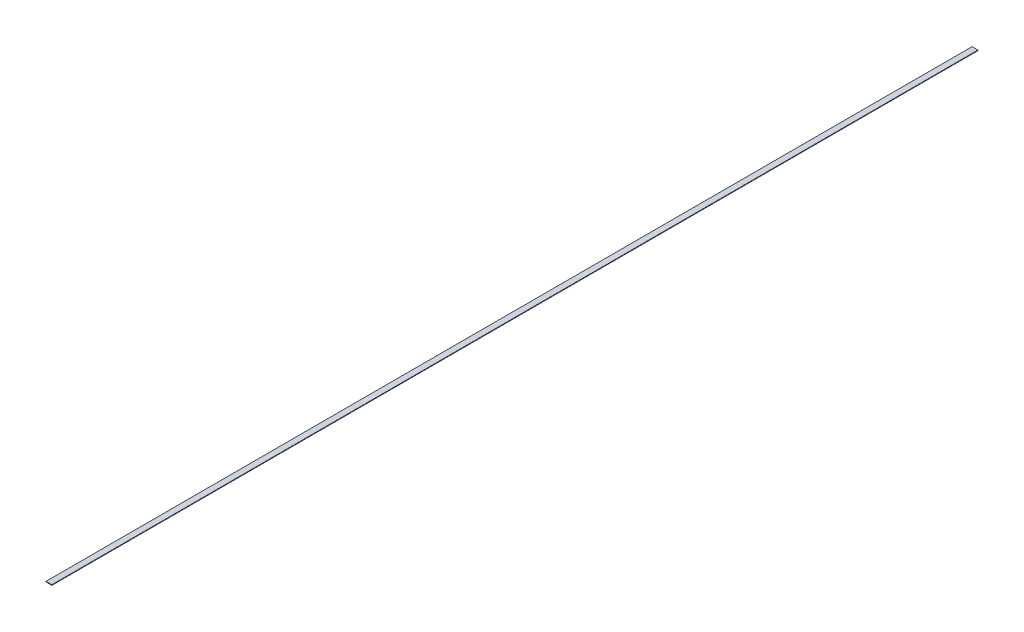
ISO-10303-21;
HEADER;
FILE_DESCRIPTION(('STEP AP214'),'2;1');
FILE_NAME('part.step','',(''),(''),'','','');
FILE_SCHEMA(('AUTOMOTIVE_DESIGN { 1 0 10303 214 1 1 1 1 }'));
ENDSEC;
DATA;
#1=APPLICATION_CONTEXT('core data for automotive mechanical design processes');
#2=APPLICATION_PROTOCOL_DEFINITION('international standard','automotive_design',2000,#1);
#3=PRODUCT_CONTEXT('',#1,'mechanical');
#4=PRODUCT('Part','Part','',(#3));
#5=PRODUCT_RELATED_PRODUCT_CATEGORY('part','',(#4));
#6=PRODUCT_DEFINITION_FORMATION('','',#4);
#7=PRODUCT_DEFINITION_CONTEXT('part definition',#1,'design');
#8=PRODUCT_DEFINITION('design','',#6,#7);
#9=PRODUCT_DEFINITION_SHAPE('','',#8);
#10=(LENGTH_UNIT() NAMED_UNIT(*) SI_UNIT(.MILLI.,.METRE.));
#11=(NAMED_UNIT(*) PLANE_ANGLE_UNIT() SI_UNIT($,.RADIAN.));
#12=(NAMED_UNIT(*) SI_UNIT($,.STERADIAN.) SOLID_ANGLE_UNIT());
#13=UNCERTAINTY_MEASURE_WITH_UNIT(LENGTH_MEASURE(1.E-05),#10,'distance_accuracy_value','');
#14=(GEOMETRIC_REPRESENTATION_CONTEXT(3) GLOBAL_UNCERTAINTY_ASSIGNED_CONTEXT((#13)) GLOBAL_UNIT_ASSIGNED_CONTEXT((#10,
#11,#12)) REPRESENTATION_CONTEXT('',''));
#15=CARTESIAN_POINT('',(0.,0.,0.));
#16=DIRECTION('',(0.,0.,1.));
#17=DIRECTION('',(1.,0.,0.));
#18=AXIS2_PLACEMENT_3D('',#15,#16,#17);
#19=CARTESIAN_POINT('',(0.,5.08,0.));
#20=DIRECTION('',(1.,0.,0.));
#21=DIRECTION('',(0.,0.,-1.));
#22=AXIS2_PLACEMENT_3D('',#19,#20,#21);
#23=PLANE('',#22);
#24=DIRECTION('',(0.,0.,1.));
#25=VECTOR('',#24,1.);
#26=CARTESIAN_POINT('',(0.,0.,0.));
#27=LINE('',#26,#25);
#28=CARTESIAN_POINT('',(0.,0.,-8051.8));
#29=VERTEX_POINT('',#28);
#30=CARTESIAN_POINT('',(0.,0.,0.));
#31=VERTEX_POINT('',#30);
#32=EDGE_CURVE('E104',#29,#31,#27,.T.);
#33=ORIENTED_EDGE('',*,*,#32,.T.);
#34=DIRECTION('',(0.,-1.,0.));
#35=VECTOR('',#34,1.);
#36=CARTESIAN_POINT('',(0.,5.08,0.));
#37=LINE('',#36,#35);
#38=CARTESIAN_POINT('',(0.,5.08,0.));
#39=VERTEX_POINT('',#38);
#40=EDGE_CURVE('E11',#39,#31,#37,.T.);
#41=ORIENTED_EDGE('',*,*,#40,.F.);
#42=DIRECTION('',(0.,0.,1.));
#43=VECTOR('',#42,1.);
#44=CARTESIAN_POINT('',(0.,5.08,0.));
#45=LINE('',#44,#43);
#46=CARTESIAN_POINT('',(0.,5.08,-8051.8));
#47=VERTEX_POINT('',#46);
#48=EDGE_CURVE('E92',#47,#39,#45,.T.);
#49=ORIENTED_EDGE('',*,*,#48,.F.);
#50=DIRECTION('',(0.,-1.,0.));
#51=VECTOR('',#50,1.);
#52=CARTESIAN_POINT('',(0.,5.08,-8051.8));
#53=LINE('',#52,#51);
#54=EDGE_CURVE('E100',#47,#29,#53,.T.);
#55=ORIENTED_EDGE('',*,*,#54,.T.);
#56=EDGE_LOOP('',(#33,#41,#49,#55));
#57=FACE_BOUND('',#56,.T.);
#58=ADVANCED_FACE('F41',(#57),#23,.F.);
#59=CARTESIAN_POINT('',(0.,5.08,0.));
#60=DIRECTION('',(0.,0.,-1.));
#61=DIRECTION('',(-1.,0.,0.));
#62=AXIS2_PLACEMENT_3D('',#59,#60,#61);
#63=PLANE('',#62);
#64=DIRECTION('',(1.,0.,0.));
#65=VECTOR('',#64,1.);
#66=CARTESIAN_POINT('',(0.,0.,0.));
#67=LINE('',#66,#65);
#68=CARTESIAN_POINT('',(50.8,0.,0.));
#69=VERTEX_POINT('',#68);
#70=EDGE_CURVE('E96',#31,#69,#67,.T.);
#71=ORIENTED_EDGE('',*,*,#70,.T.);
#72=DIRECTION('',(0.,-1.,0.));
#73=VECTOR('',#72,1.);
#74=CARTESIAN_POINT('',(50.8,5.08,0.));
#75=LINE('',#74,#73);
#76=CARTESIAN_POINT('',(50.8,5.08,0.));
#77=VERTEX_POINT('',#76);
#78=EDGE_CURVE('E49',#77,#69,#75,.T.);
#79=ORIENTED_EDGE('',*,*,#78,.F.);
#80=DIRECTION('',(1.,0.,0.));
#81=VECTOR('',#80,1.);
#82=CARTESIAN_POINT('',(0.,5.08,0.));
#83=LINE('',#82,#81);
#84=EDGE_CURVE('E87',#39,#77,#83,.T.);
#85=ORIENTED_EDGE('',*,*,#84,.F.);
#86=ORIENTED_EDGE('',*,*,#40,.T.);
#87=EDGE_LOOP('',(#71,#79,#85,#86));
#88=FACE_BOUND('',#87,.T.);
#89=ADVANCED_FACE('F95',(#88),#63,.F.);
#90=CARTESIAN_POINT('',(50.8,5.08,0.));
#91=DIRECTION('',(-1.,0.,0.));
#92=DIRECTION('',(0.,0.,1.));
#93=AXIS2_PLACEMENT_3D('',#90,#91,#92);
#94=PLANE('',#93);
#95=DIRECTION('',(0.,0.,-1.));
#96=VECTOR('',#95,1.);
#97=CARTESIAN_POINT('',(50.8,0.,0.));
#98=LINE('',#97,#96);
#99=CARTESIAN_POINT('',(50.8,0.,-8051.8));
#100=VERTEX_POINT('',#99);
#101=EDGE_CURVE('E74',#69,#100,#98,.T.);
#102=ORIENTED_EDGE('',*,*,#101,.T.);
#103=DIRECTION('',(0.,-1.,0.));
#104=VECTOR('',#103,1.);
#105=CARTESIAN_POINT('',(50.8,5.08,-8051.8));
#106=LINE('',#105,#104);
#107=CARTESIAN_POINT('',(50.8,5.08,-8051.8));
#108=VERTEX_POINT('',#107);
#109=EDGE_CURVE('E97',#108,#100,#106,.T.);
#110=ORIENTED_EDGE('',*,*,#109,.F.);
#111=DIRECTION('',(0.,0.,-1.));
#112=VECTOR('',#111,1.);
#113=CARTESIAN_POINT('',(50.8,5.08,0.));
#114=LINE('',#113,#112);
#115=EDGE_CURVE('E90',#77,#108,#114,.T.);
#116=ORIENTED_EDGE('',*,*,#115,.F.);
#117=ORIENTED_EDGE('',*,*,#78,.T.);
#118=EDGE_LOOP('',(#102,#110,#116,#117));
#119=FACE_BOUND('',#118,.T.);
#120=ADVANCED_FACE('F98',(#119),#94,.F.);
#121=CARTESIAN_POINT('',(0.,5.08,-8051.8));
#122=DIRECTION('',(0.,0.,1.));
#123=DIRECTION('',(1.,0.,0.));
#124=AXIS2_PLACEMENT_3D('',#121,#122,#123);
#125=PLANE('',#124);
#126=DIRECTION('',(-1.,0.,0.));
#127=VECTOR('',#126,1.);
#128=CARTESIAN_POINT('',(0.,0.,-8051.8));
#129=LINE('',#128,#127);
#130=EDGE_CURVE('E80',#100,#29,#129,.T.);
#131=ORIENTED_EDGE('',*,*,#130,.T.);
#132=ORIENTED_EDGE('',*,*,#54,.F.);
#133=DIRECTION('',(-1.,0.,0.));
#134=VECTOR('',#133,1.);
#135=CARTESIAN_POINT('',(0.,5.08,-8051.8));
#136=LINE('',#135,#134);
#137=EDGE_CURVE('E57',#108,#47,#136,.T.);
#138=ORIENTED_EDGE('',*,*,#137,.F.);
#139=ORIENTED_EDGE('',*,*,#109,.T.);
#140=EDGE_LOOP('',(#131,#132,#138,#139));
#141=FACE_BOUND('',#140,.T.);
#142=ADVANCED_FACE('F111',(#141),#125,.F.);
#143=CARTESIAN_POINT('',(0.,5.08,0.));
#144=DIRECTION('',(0.,-1.,0.));
#145=DIRECTION('',(0.,0.,-1.));
#146=AXIS2_PLACEMENT_3D('',#143,#144,#145);
#147=PLANE('',#146);
#148=ORIENTED_EDGE('',*,*,#48,.T.);
#149=ORIENTED_EDGE('',*,*,#84,.T.);
#150=ORIENTED_EDGE('',*,*,#115,.T.);
#151=ORIENTED_EDGE('',*,*,#137,.T.);
#152=EDGE_LOOP('',(#148,#149,#150,#151));
#153=FACE_BOUND('',#152,.T.);
#154=ADVANCED_FACE('F88',(#153),#147,.F.);
#155=CARTESIAN_POINT('',(0.,0.,0.));
#156=DIRECTION('',(0.,-1.,0.));
#157=DIRECTION('',(0.,0.,-1.));
#158=AXIS2_PLACEMENT_3D('',#155,#156,#157);
#159=PLANE('',#158);
#160=ORIENTED_EDGE('',*,*,#32,.F.);
#161=ORIENTED_EDGE('',*,*,#130,.F.);
#162=ORIENTED_EDGE('',*,*,#101,.F.);
#163=ORIENTED_EDGE('',*,*,#70,.F.);
#164=EDGE_LOOP('',(#160,#161,#162,#163));
#165=FACE_BOUND('',#164,.T.);
#166=ADVANCED_FACE('F114',(#165),#159,.T.);
#167=CLOSED_SHELL('',(#58,#89,#120,#142,#154,#166));
#168=MANIFOLD_SOLID_BREP('B2',#167);
#169=ADVANCED_BREP_SHAPE_REPRESENTATION('',(#18,#168),#14);
#170=SHAPE_DEFINITION_REPRESENTATION(#9,#169);
ENDSEC;
END-ISO-10303-21;
